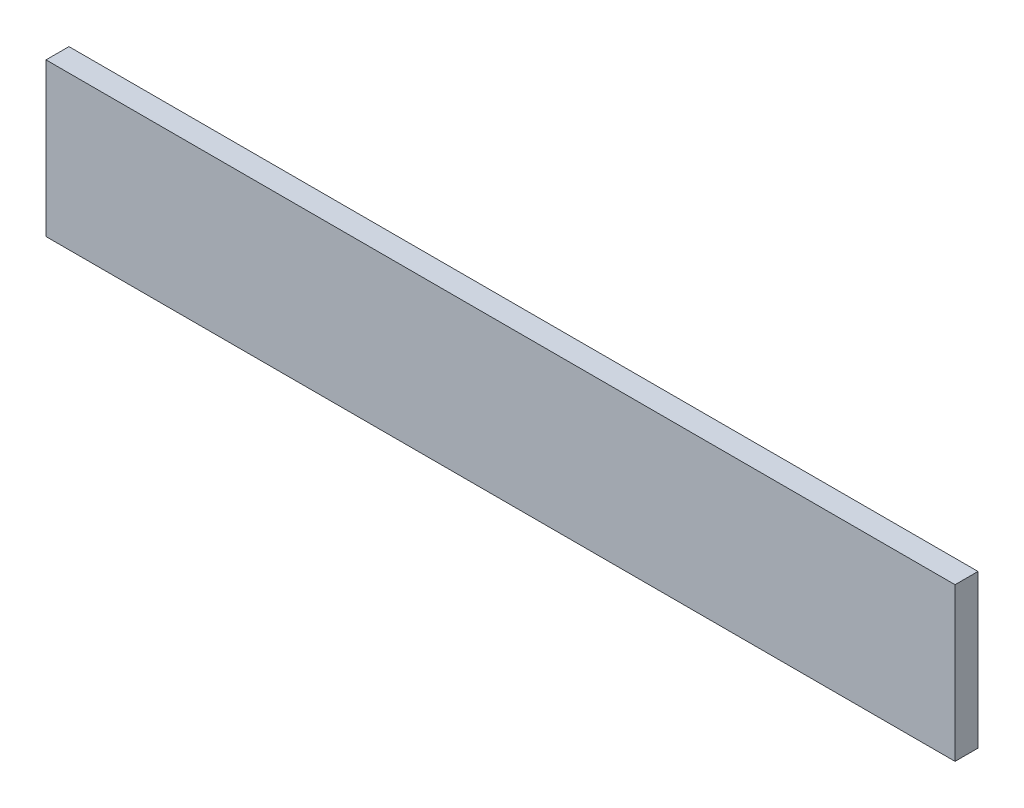
ISO-10303-21;
HEADER;
FILE_DESCRIPTION(('STEP AP214'),'2;1');
FILE_NAME('part.step','',(''),(''),'','','');
FILE_SCHEMA(('AUTOMOTIVE_DESIGN { 1 0 10303 214 1 1 1 1 }'));
ENDSEC;
DATA;
#1=APPLICATION_CONTEXT('core data for automotive mechanical design processes');
#2=APPLICATION_PROTOCOL_DEFINITION('international standard','automotive_design',2000,#1);
#3=PRODUCT_CONTEXT('',#1,'mechanical');
#4=PRODUCT('Part','Part','',(#3));
#5=PRODUCT_RELATED_PRODUCT_CATEGORY('part','',(#4));
#6=PRODUCT_DEFINITION_FORMATION('','',#4);
#7=PRODUCT_DEFINITION_CONTEXT('part definition',#1,'design');
#8=PRODUCT_DEFINITION('design','',#6,#7);
#9=PRODUCT_DEFINITION_SHAPE('','',#8);
#10=(LENGTH_UNIT() NAMED_UNIT(*) SI_UNIT(.MILLI.,.METRE.));
#11=(NAMED_UNIT(*) PLANE_ANGLE_UNIT() SI_UNIT($,.RADIAN.));
#12=(NAMED_UNIT(*) SI_UNIT($,.STERADIAN.) SOLID_ANGLE_UNIT());
#13=UNCERTAINTY_MEASURE_WITH_UNIT(LENGTH_MEASURE(1.E-05),#10,'distance_accuracy_value','');
#14=(GEOMETRIC_REPRESENTATION_CONTEXT(3) GLOBAL_UNCERTAINTY_ASSIGNED_CONTEXT((#13)) GLOBAL_UNIT_ASSIGNED_CONTEXT((#10,
#11,#12)) REPRESENTATION_CONTEXT('',''));
#15=CARTESIAN_POINT('',(0.,0.,0.));
#16=DIRECTION('',(0.,0.,1.));
#17=DIRECTION('',(1.,0.,0.));
#18=AXIS2_PLACEMENT_3D('',#15,#16,#17);
#19=CARTESIAN_POINT('',(594.,-50.,-7.5));
#20=DIRECTION('',(0.,0.,1.));
#21=DIRECTION('',(1.,0.,0.));
#22=AXIS2_PLACEMENT_3D('',#19,#20,#21);
#23=PLANE('',#22);
#24=DIRECTION('',(0.,1.,0.));
#25=VECTOR('',#24,1.);
#26=CARTESIAN_POINT('',(0.,-50.,-7.5));
#27=LINE('',#26,#25);
#28=CARTESIAN_POINT('',(0.,-50.,-7.5));
#29=VERTEX_POINT('',#28);
#30=CARTESIAN_POINT('',(0.,50.,-7.5));
#31=VERTEX_POINT('',#30);
#32=EDGE_CURVE('E107',#29,#31,#27,.T.);
#33=ORIENTED_EDGE('',*,*,#32,.T.);
#34=DIRECTION('',(-1.,0.,0.));
#35=VECTOR('',#34,1.);
#36=CARTESIAN_POINT('',(594.,50.,-7.5));
#37=LINE('',#36,#35);
#38=CARTESIAN_POINT('',(594.,50.,-7.5));
#39=VERTEX_POINT('',#38);
#40=EDGE_CURVE('E11',#39,#31,#37,.T.);
#41=ORIENTED_EDGE('',*,*,#40,.F.);
#42=DIRECTION('',(0.,1.,0.));
#43=VECTOR('',#42,1.);
#44=CARTESIAN_POINT('',(594.,-50.,-7.5));
#45=LINE('',#44,#43);
#46=CARTESIAN_POINT('',(594.,-50.,-7.5));
#47=VERTEX_POINT('',#46);
#48=EDGE_CURVE('E91',#47,#39,#45,.T.);
#49=ORIENTED_EDGE('',*,*,#48,.F.);
#50=DIRECTION('',(-1.,0.,0.));
#51=VECTOR('',#50,1.);
#52=CARTESIAN_POINT('',(594.,-50.,-7.5));
#53=LINE('',#52,#51);
#54=EDGE_CURVE('E103',#47,#29,#53,.T.);
#55=ORIENTED_EDGE('',*,*,#54,.T.);
#56=EDGE_LOOP('',(#33,#41,#49,#55));
#57=FACE_BOUND('',#56,.T.);
#58=ADVANCED_FACE('F39',(#57),#23,.F.);
#59=CARTESIAN_POINT('',(594.,50.,7.5));
#60=DIRECTION('',(0.,-1.,0.));
#61=DIRECTION('',(0.,0.,-1.));
#62=AXIS2_PLACEMENT_3D('',#59,#60,#61);
#63=PLANE('',#62);
#64=DIRECTION('',(0.,0.,1.));
#65=VECTOR('',#64,1.);
#66=CARTESIAN_POINT('',(0.,50.,7.5));
#67=LINE('',#66,#65);
#68=CARTESIAN_POINT('',(0.,50.,7.5));
#69=VERTEX_POINT('',#68);
#70=EDGE_CURVE('E96',#31,#69,#67,.T.);
#71=ORIENTED_EDGE('',*,*,#70,.T.);
#72=DIRECTION('',(-1.,0.,0.));
#73=VECTOR('',#72,1.);
#74=CARTESIAN_POINT('',(594.,50.,7.5));
#75=LINE('',#74,#73);
#76=CARTESIAN_POINT('',(594.,50.,7.5));
#77=VERTEX_POINT('',#76);
#78=EDGE_CURVE('E48',#77,#69,#75,.T.);
#79=ORIENTED_EDGE('',*,*,#78,.F.);
#80=DIRECTION('',(0.,0.,1.));
#81=VECTOR('',#80,1.);
#82=CARTESIAN_POINT('',(594.,50.,7.5));
#83=LINE('',#82,#81);
#84=EDGE_CURVE('E86',#39,#77,#83,.T.);
#85=ORIENTED_EDGE('',*,*,#84,.F.);
#86=ORIENTED_EDGE('',*,*,#40,.T.);
#87=EDGE_LOOP('',(#71,#79,#85,#86));
#88=FACE_BOUND('',#87,.T.);
#89=ADVANCED_FACE('F95',(#88),#63,.F.);
#90=CARTESIAN_POINT('',(594.,-50.,7.5));
#91=DIRECTION('',(0.,0.,-1.));
#92=DIRECTION('',(-1.,0.,0.));
#93=AXIS2_PLACEMENT_3D('',#90,#91,#92);
#94=PLANE('',#93);
#95=DIRECTION('',(0.,-1.,0.));
#96=VECTOR('',#95,1.);
#97=CARTESIAN_POINT('',(0.,-50.,7.5));
#98=LINE('',#97,#96);
#99=CARTESIAN_POINT('',(0.,-50.,7.5));
#100=VERTEX_POINT('',#99);
#101=EDGE_CURVE('E73',#69,#100,#98,.T.);
#102=ORIENTED_EDGE('',*,*,#101,.T.);
#103=DIRECTION('',(-1.,0.,0.));
#104=VECTOR('',#103,1.);
#105=CARTESIAN_POINT('',(594.,-50.,7.5));
#106=LINE('',#105,#104);
#107=CARTESIAN_POINT('',(594.,-50.,7.5));
#108=VERTEX_POINT('',#107);
#109=EDGE_CURVE('E98',#108,#100,#106,.T.);
#110=ORIENTED_EDGE('',*,*,#109,.F.);
#111=DIRECTION('',(0.,-1.,0.));
#112=VECTOR('',#111,1.);
#113=CARTESIAN_POINT('',(594.,-50.,7.5));
#114=LINE('',#113,#112);
#115=EDGE_CURVE('E89',#77,#108,#114,.T.);
#116=ORIENTED_EDGE('',*,*,#115,.F.);
#117=ORIENTED_EDGE('',*,*,#78,.T.);
#118=EDGE_LOOP('',(#102,#110,#116,#117));
#119=FACE_BOUND('',#118,.T.);
#120=ADVANCED_FACE('F99',(#119),#94,.F.);
#121=CARTESIAN_POINT('',(594.,-50.,7.5));
#122=DIRECTION('',(0.,1.,0.));
#123=DIRECTION('',(0.,0.,1.));
#124=AXIS2_PLACEMENT_3D('',#121,#122,#123);
#125=PLANE('',#124);
#126=DIRECTION('',(0.,0.,-1.));
#127=VECTOR('',#126,1.);
#128=CARTESIAN_POINT('',(0.,-50.,7.5));
#129=LINE('',#128,#127);
#130=EDGE_CURVE('E79',#100,#29,#129,.T.);
#131=ORIENTED_EDGE('',*,*,#130,.T.);
#132=ORIENTED_EDGE('',*,*,#54,.F.);
#133=DIRECTION('',(0.,0.,-1.));
#134=VECTOR('',#133,1.);
#135=CARTESIAN_POINT('',(594.,-50.,7.5));
#136=LINE('',#135,#134);
#137=EDGE_CURVE('E56',#108,#47,#136,.T.);
#138=ORIENTED_EDGE('',*,*,#137,.F.);
#139=ORIENTED_EDGE('',*,*,#109,.T.);
#140=EDGE_LOOP('',(#131,#132,#138,#139));
#141=FACE_BOUND('',#140,.T.);
#142=ADVANCED_FACE('F120',(#141),#125,.F.);
#143=CARTESIAN_POINT('',(594.,0.,0.));
#144=DIRECTION('',(-1.,0.,0.));
#145=DIRECTION('',(0.,0.,1.));
#146=AXIS2_PLACEMENT_3D('',#143,#144,#145);
#147=PLANE('',#146);
#148=ORIENTED_EDGE('',*,*,#48,.T.);
#149=ORIENTED_EDGE('',*,*,#84,.T.);
#150=ORIENTED_EDGE('',*,*,#115,.T.);
#151=ORIENTED_EDGE('',*,*,#137,.T.);
#152=EDGE_LOOP('',(#148,#149,#150,#151));
#153=FACE_BOUND('',#152,.T.);
#154=ADVANCED_FACE('F87',(#153),#147,.F.);
#155=CARTESIAN_POINT('',(0.,0.,0.));
#156=DIRECTION('',(-1.,0.,0.));
#157=DIRECTION('',(0.,0.,1.));
#158=AXIS2_PLACEMENT_3D('',#155,#156,#157);
#159=PLANE('',#158);
#160=ORIENTED_EDGE('',*,*,#32,.F.);
#161=ORIENTED_EDGE('',*,*,#130,.F.);
#162=ORIENTED_EDGE('',*,*,#101,.F.);
#163=ORIENTED_EDGE('',*,*,#70,.F.);
#164=EDGE_LOOP('',(#160,#161,#162,#163));
#165=FACE_BOUND('',#164,.T.);
#166=ADVANCED_FACE('F123',(#165),#159,.T.);
#167=CLOSED_SHELL('',(#58,#89,#120,#142,#154,#166));
#168=MANIFOLD_SOLID_BREP('B2',#167);
#169=ADVANCED_BREP_SHAPE_REPRESENTATION('',(#18,#168),#14);
#170=SHAPE_DEFINITION_REPRESENTATION(#9,#169);
ENDSEC;
END-ISO-10303-21;
